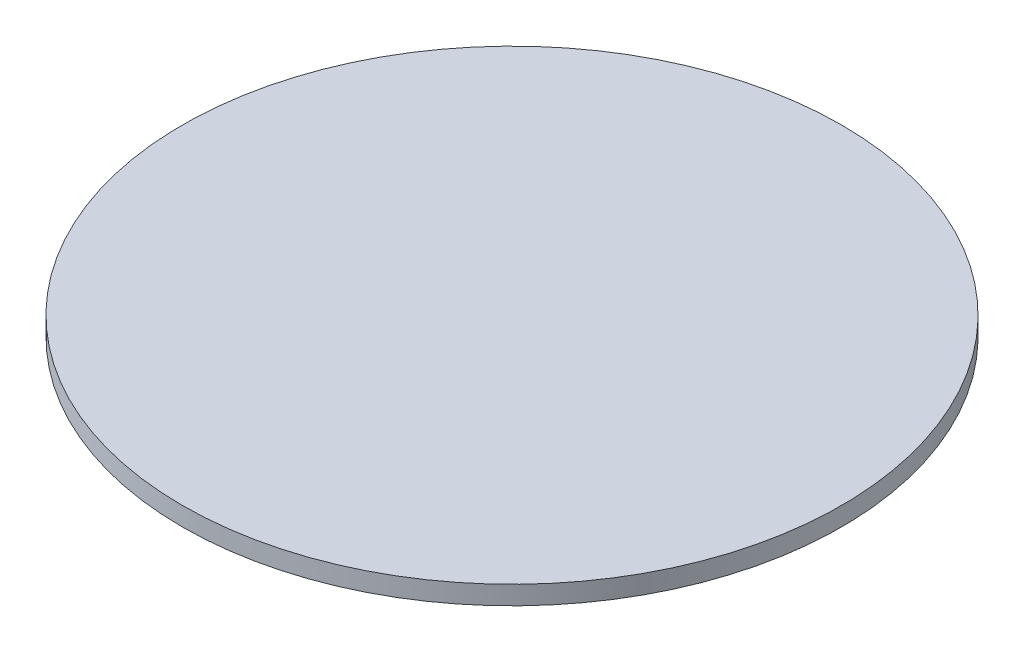
ISO-10303-21;
HEADER;
FILE_DESCRIPTION(('STEP AP214'),'2;1');
FILE_NAME('part.step','',(''),(''),'','','');
FILE_SCHEMA(('AUTOMOTIVE_DESIGN { 1 0 10303 214 1 1 1 1 }'));
ENDSEC;
DATA;
#1=APPLICATION_CONTEXT('core data for automotive mechanical design processes');
#2=APPLICATION_PROTOCOL_DEFINITION('international standard','automotive_design',2000,#1);
#3=PRODUCT_CONTEXT('',#1,'mechanical');
#4=PRODUCT('Part','Part','',(#3));
#5=PRODUCT_RELATED_PRODUCT_CATEGORY('part','',(#4));
#6=PRODUCT_DEFINITION_FORMATION('','',#4);
#7=PRODUCT_DEFINITION_CONTEXT('part definition',#1,'design');
#8=PRODUCT_DEFINITION('design','',#6,#7);
#9=PRODUCT_DEFINITION_SHAPE('','',#8);
#10=(LENGTH_UNIT() NAMED_UNIT(*) SI_UNIT(.MILLI.,.METRE.));
#11=(NAMED_UNIT(*) PLANE_ANGLE_UNIT() SI_UNIT($,.RADIAN.));
#12=(NAMED_UNIT(*) SI_UNIT($,.STERADIAN.) SOLID_ANGLE_UNIT());
#13=UNCERTAINTY_MEASURE_WITH_UNIT(LENGTH_MEASURE(1.E-05),#10,'distance_accuracy_value','');
#14=(GEOMETRIC_REPRESENTATION_CONTEXT(3) GLOBAL_UNCERTAINTY_ASSIGNED_CONTEXT((#13)) GLOBAL_UNIT_ASSIGNED_CONTEXT((#10,
#11,#12)) REPRESENTATION_CONTEXT('',''));
#15=CARTESIAN_POINT('',(0.,0.,0.));
#16=DIRECTION('',(0.,0.,1.));
#17=DIRECTION('',(1.,0.,0.));
#18=AXIS2_PLACEMENT_3D('',#15,#16,#17);
#19=CARTESIAN_POINT('',(0.,0.17,0.));
#20=DIRECTION('',(0.,-1.,0.));
#21=DIRECTION('',(0.,0.,-1.));
#22=AXIS2_PLACEMENT_3D('',#19,#20,#21);
#23=CYLINDRICAL_SURFACE('',#22,3.);
#24=CARTESIAN_POINT('',(0.,0.17,0.));
#25=DIRECTION('',(0.,1.,0.));
#26=DIRECTION('',(0.,0.,1.));
#27=AXIS2_PLACEMENT_3D('',#24,#25,#26);
#28=CIRCLE('',#27,3.);
#29=CARTESIAN_POINT('',(0.,0.17,3.));
#30=VERTEX_POINT('',#29);
#31=EDGE_CURVE('E10',#30,#30,#28,.T.);
#32=ORIENTED_EDGE('',*,*,#31,.F.);
#33=EDGE_LOOP('',(#32));
#34=FACE_BOUND('',#33,.T.);
#35=CARTESIAN_POINT('',(0.,0.,0.));
#36=DIRECTION('',(0.,1.,0.));
#37=DIRECTION('',(0.,0.,1.));
#38=AXIS2_PLACEMENT_3D('',#35,#36,#37);
#39=CIRCLE('',#38,3.);
#40=CARTESIAN_POINT('',(0.,0.,3.));
#41=VERTEX_POINT('',#40);
#42=EDGE_CURVE('E40',#41,#41,#39,.T.);
#43=ORIENTED_EDGE('',*,*,#42,.T.);
#44=EDGE_LOOP('',(#43));
#45=FACE_BOUND('',#44,.T.);
#46=ADVANCED_FACE('F37',(#34,#45),#23,.T.);
#47=CARTESIAN_POINT('',(0.,0.17,0.));
#48=DIRECTION('',(0.,1.,0.));
#49=DIRECTION('',(0.,0.,1.));
#50=AXIS2_PLACEMENT_3D('',#47,#48,#49);
#51=PLANE('',#50);
#52=ORIENTED_EDGE('',*,*,#31,.T.);
#53=EDGE_LOOP('',(#52));
#54=FACE_BOUND('',#53,.T.);
#55=ADVANCED_FACE('F52',(#54),#51,.T.);
#56=CARTESIAN_POINT('',(0.,0.,0.));
#57=DIRECTION('',(0.,1.,0.));
#58=DIRECTION('',(0.,0.,1.));
#59=AXIS2_PLACEMENT_3D('',#56,#57,#58);
#60=PLANE('',#59);
#61=ORIENTED_EDGE('',*,*,#42,.F.);
#62=EDGE_LOOP('',(#61));
#63=FACE_BOUND('',#62,.T.);
#64=ADVANCED_FACE('F50',(#63),#60,.F.);
#65=CLOSED_SHELL('',(#46,#55,#64));
#66=MANIFOLD_SOLID_BREP('B2',#65);
#67=ADVANCED_BREP_SHAPE_REPRESENTATION('',(#18,#66),#14);
#68=SHAPE_DEFINITION_REPRESENTATION(#9,#67);
ENDSEC;
END-ISO-10303-21;
